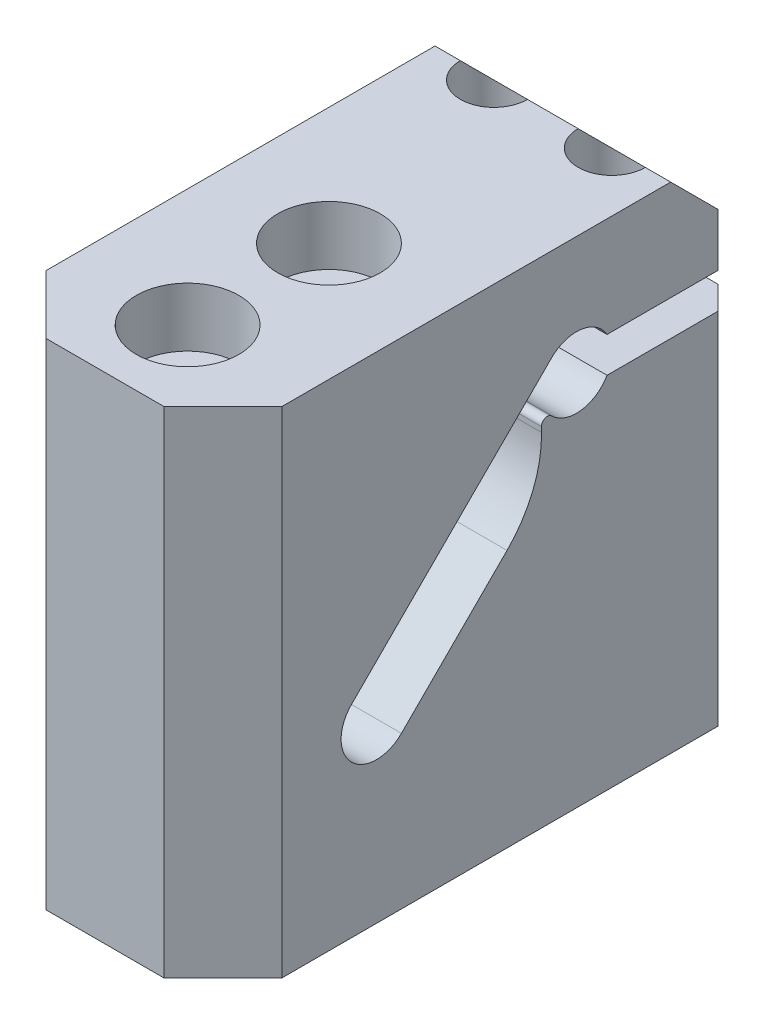
ISO-10303-21;
HEADER;
FILE_DESCRIPTION(('STEP AP214'),'2;1');
FILE_NAME('part.step','',(''),(''),'','','');
FILE_SCHEMA(('AUTOMOTIVE_DESIGN { 1 0 10303 214 1 1 1 1 }'));
ENDSEC;
DATA;
#1=APPLICATION_CONTEXT('core data for automotive mechanical design processes');
#2=APPLICATION_PROTOCOL_DEFINITION('international standard','automotive_design',2000,#1);
#3=PRODUCT_CONTEXT('',#1,'mechanical');
#4=PRODUCT('Part','Part','',(#3));
#5=PRODUCT_RELATED_PRODUCT_CATEGORY('part','',(#4));
#6=PRODUCT_DEFINITION_FORMATION('','',#4);
#7=PRODUCT_DEFINITION_CONTEXT('part definition',#1,'design');
#8=PRODUCT_DEFINITION('design','',#6,#7);
#9=PRODUCT_DEFINITION_SHAPE('','',#8);
#10=(LENGTH_UNIT() NAMED_UNIT(*) SI_UNIT(.MILLI.,.METRE.));
#11=(NAMED_UNIT(*) PLANE_ANGLE_UNIT() SI_UNIT($,.RADIAN.));
#12=(NAMED_UNIT(*) SI_UNIT($,.STERADIAN.) SOLID_ANGLE_UNIT());
#13=UNCERTAINTY_MEASURE_WITH_UNIT(LENGTH_MEASURE(1.E-05),#10,'distance_accuracy_value','');
#14=(GEOMETRIC_REPRESENTATION_CONTEXT(3) GLOBAL_UNCERTAINTY_ASSIGNED_CONTEXT((#13)) GLOBAL_UNIT_ASSIGNED_CONTEXT((#10,
#11,#12)) REPRESENTATION_CONTEXT('',''));
#15=CARTESIAN_POINT('',(0.,0.,0.));
#16=DIRECTION('',(0.,0.,1.));
#17=DIRECTION('',(1.,0.,0.));
#18=AXIS2_PLACEMENT_3D('',#15,#16,#17);
#19=CARTESIAN_POINT('',(20.,1.5,0.));
#20=DIRECTION('',(0.,-1.,0.));
#21=DIRECTION('',(0.,0.,-1.));
#22=AXIS2_PLACEMENT_3D('',#19,#20,#21);
#23=PLANE('',#22);
#24=DIRECTION('',(0.,0.,1.));
#25=VECTOR('',#24,1.);
#26=CARTESIAN_POINT('',(0.,1.5,0.));
#27=LINE('',#26,#25);
#28=CARTESIAN_POINT('',(0.,1.5,-12.));
#29=VERTEX_POINT('',#28);
#30=CARTESIAN_POINT('',(0.,1.5,-2.59807621135332));
#31=VERTEX_POINT('',#30);
#32=EDGE_CURVE('E350',#29,#31,#27,.T.);
#33=ORIENTED_EDGE('',*,*,#32,.F.);
#34=DIRECTION('',(-0.707106781186545,0.,0.70710678118655));
#35=VECTOR('',#34,1.);
#36=CARTESIAN_POINT('',(3.99999999999993,1.5,-16.));
#37=LINE('',#36,#35);
#38=CARTESIAN_POINT('',(1.99999999999999,1.5,-14.));
#39=VERTEX_POINT('',#38);
#40=EDGE_CURVE('E305',#29,#39,#37,.F.);
#41=ORIENTED_EDGE('',*,*,#40,.T.);
#42=DIRECTION('',(-1.,0.,0.));
#43=VECTOR('',#42,1.);
#44=CARTESIAN_POINT('',(20.,1.5,-14.));
#45=LINE('',#44,#43);
#46=CARTESIAN_POINT('',(18.,1.5,-14.));
#47=VERTEX_POINT('',#46);
#48=EDGE_CURVE('E229',#47,#39,#45,.T.);
#49=ORIENTED_EDGE('',*,*,#48,.F.);
#50=DIRECTION('',(0.707106781186549,0.,0.707106781186546));
#51=VECTOR('',#50,1.);
#52=CARTESIAN_POINT('',(26.,1.5,-6.00000000000003));
#53=LINE('',#52,#51);
#54=CARTESIAN_POINT('',(20.,1.5,-12.));
#55=VERTEX_POINT('',#54);
#56=EDGE_CURVE('E50',#47,#55,#53,.T.);
#57=ORIENTED_EDGE('',*,*,#56,.T.);
#58=DIRECTION('',(0.,0.,1.));
#59=VECTOR('',#58,1.);
#60=CARTESIAN_POINT('',(20.,1.5,0.));
#61=LINE('',#60,#59);
#62=CARTESIAN_POINT('',(20.,1.5,-2.59807621135332));
#63=VERTEX_POINT('',#62);
#64=EDGE_CURVE('E438',#55,#63,#61,.T.);
#65=ORIENTED_EDGE('',*,*,#64,.T.);
#66=DIRECTION('',(-1.,0.,0.));
#67=VECTOR('',#66,1.);
#68=CARTESIAN_POINT('',(20.,1.5,-2.59807621135332));
#69=LINE('',#68,#67);
#70=EDGE_CURVE('E232',#63,#31,#69,.T.);
#71=ORIENTED_EDGE('',*,*,#70,.T.);
#72=EDGE_LOOP('',(#33,#41,#49,#57,#65,#71));
#73=FACE_BOUND('',#72,.T.);
#74=CARTESIAN_POINT('',(5.,1.5,-8.));
#75=DIRECTION('',(0.,-1.,0.));
#76=DIRECTION('',(0.,0.,-1.));
#77=AXIS2_PLACEMENT_3D('',#74,#75,#76);
#78=CIRCLE('',#77,1.5);
#79=CARTESIAN_POINT('',(5.,1.5,-9.50000000000001));
#80=VERTEX_POINT('',#79);
#81=EDGE_CURVE('E830',#80,#80,#78,.T.);
#82=ORIENTED_EDGE('',*,*,#81,.F.);
#83=EDGE_LOOP('',(#82));
#84=FACE_BOUND('',#83,.T.);
#85=CARTESIAN_POINT('',(15.,1.5,-8.));
#86=DIRECTION('',(0.,-1.,0.));
#87=DIRECTION('',(0.,0.,-1.));
#88=AXIS2_PLACEMENT_3D('',#85,#86,#87);
#89=CIRCLE('',#88,1.5);
#90=CARTESIAN_POINT('',(15.,1.5,-9.50000000000001));
#91=VERTEX_POINT('',#90);
#92=EDGE_CURVE('E815',#91,#91,#89,.F.);
#93=ORIENTED_EDGE('',*,*,#92,.T.);
#94=EDGE_LOOP('',(#93));
#95=FACE_BOUND('',#94,.T.);
#96=ADVANCED_FACE('F35',(#73,#84,#95),#23,.T.);
#97=CARTESIAN_POINT('',(20.,-32.,0.));
#98=DIRECTION('',(0.,-1.,0.));
#99=DIRECTION('',(0.,0.,-1.));
#100=AXIS2_PLACEMENT_3D('',#97,#98,#99);
#101=PLANE('',#100);
#102=DIRECTION('',(0.,0.,1.));
#103=VECTOR('',#102,1.);
#104=CARTESIAN_POINT('',(0.,-32.,0.));
#105=LINE('',#104,#103);
#106=CARTESIAN_POINT('',(0.,-32.,-12.));
#107=VERTEX_POINT('',#106);
#108=CARTESIAN_POINT('',(0.,-32.,25.));
#109=VERTEX_POINT('',#108);
#110=EDGE_CURVE('E358',#107,#109,#105,.T.);
#111=ORIENTED_EDGE('',*,*,#110,.F.);
#112=DIRECTION('',(-0.707106781186545,0.,0.70710678118655));
#113=VECTOR('',#112,1.);
#114=CARTESIAN_POINT('',(3.99999999999994,-32.,-16.));
#115=LINE('',#114,#113);
#116=CARTESIAN_POINT('',(1.99999999999999,-32.,-14.));
#117=VERTEX_POINT('',#116);
#118=EDGE_CURVE('E294',#107,#117,#115,.F.);
#119=ORIENTED_EDGE('',*,*,#118,.T.);
#120=DIRECTION('',(-1.,0.,0.));
#121=VECTOR('',#120,1.);
#122=CARTESIAN_POINT('',(20.,-32.,-14.));
#123=LINE('',#122,#121);
#124=CARTESIAN_POINT('',(18.,-32.,-14.));
#125=VERTEX_POINT('',#124);
#126=EDGE_CURVE('E372',#125,#117,#123,.T.);
#127=ORIENTED_EDGE('',*,*,#126,.F.);
#128=DIRECTION('',(0.707106781186549,0.,0.707106781186546));
#129=VECTOR('',#128,1.);
#130=CARTESIAN_POINT('',(26.,-32.,-6.00000000000003));
#131=LINE('',#130,#129);
#132=CARTESIAN_POINT('',(20.,-32.,-12.));
#133=VERTEX_POINT('',#132);
#134=EDGE_CURVE('E292',#125,#133,#131,.T.);
#135=ORIENTED_EDGE('',*,*,#134,.T.);
#136=DIRECTION('',(0.,0.,1.));
#137=VECTOR('',#136,1.);
#138=CARTESIAN_POINT('',(20.,-32.,0.));
#139=LINE('',#138,#137);
#140=CARTESIAN_POINT('',(20.,-32.,25.));
#141=VERTEX_POINT('',#140);
#142=EDGE_CURVE('E315',#133,#141,#139,.T.);
#143=ORIENTED_EDGE('',*,*,#142,.T.);
#144=DIRECTION('',(0.707106781186546,0.,-0.707106781186549));
#145=VECTOR('',#144,1.);
#146=CARTESIAN_POINT('',(32.5,-32.,12.4999999999999));
#147=LINE('',#146,#145);
#148=CARTESIAN_POINT('',(15.,-32.,30.));
#149=VERTEX_POINT('',#148);
#150=EDGE_CURVE('E274',#141,#149,#147,.F.);
#151=ORIENTED_EDGE('',*,*,#150,.T.);
#152=DIRECTION('',(-1.,0.,0.));
#153=VECTOR('',#152,1.);
#154=CARTESIAN_POINT('',(20.,-32.,30.));
#155=LINE('',#154,#153);
#156=CARTESIAN_POINT('',(5.00000000000001,-32.,30.));
#157=VERTEX_POINT('',#156);
#158=EDGE_CURVE('E374',#149,#157,#155,.T.);
#159=ORIENTED_EDGE('',*,*,#158,.T.);
#160=DIRECTION('',(-0.707106781186549,0.,-0.707106781186546));
#161=VECTOR('',#160,1.);
#162=CARTESIAN_POINT('',(-2.49999999999997,-32.,22.5000000000001));
#163=LINE('',#162,#161);
#164=EDGE_CURVE('E271',#157,#109,#163,.T.);
#165=ORIENTED_EDGE('',*,*,#164,.T.);
#166=EDGE_LOOP('',(#111,#119,#127,#135,#143,#151,#159,#165));
#167=FACE_BOUND('',#166,.T.);
#168=CARTESIAN_POINT('',(10.,-32.,23.));
#169=DIRECTION('',(0.,1.,0.));
#170=DIRECTION('',(0.,0.,1.));
#171=AXIS2_PLACEMENT_3D('',#168,#169,#170);
#172=CIRCLE('',#171,2.5);
#173=CARTESIAN_POINT('',(10.,-32.,25.5));
#174=VERTEX_POINT('',#173);
#175=EDGE_CURVE('E858',#174,#174,#172,.T.);
#176=ORIENTED_EDGE('',*,*,#175,.T.);
#177=EDGE_LOOP('',(#176));
#178=FACE_BOUND('',#177,.T.);
#179=CARTESIAN_POINT('',(10.,-32.,11.));
#180=DIRECTION('',(0.,1.,0.));
#181=DIRECTION('',(0.,0.,1.));
#182=AXIS2_PLACEMENT_3D('',#179,#180,#181);
#183=CIRCLE('',#182,2.5);
#184=CARTESIAN_POINT('',(10.,-32.,13.5));
#185=VERTEX_POINT('',#184);
#186=EDGE_CURVE('E859',#185,#185,#183,.T.);
#187=ORIENTED_EDGE('',*,*,#186,.T.);
#188=EDGE_LOOP('',(#187));
#189=FACE_BOUND('',#188,.T.);
#190=CARTESIAN_POINT('',(5.,-32.,-8.00000000000001));
#191=DIRECTION('',(0.,1.,0.));
#192=DIRECTION('',(0.,0.,1.));
#193=AXIS2_PLACEMENT_3D('',#190,#191,#192);
#194=CIRCLE('',#193,1.5);
#195=CARTESIAN_POINT('',(5.,-32.,-6.50000000000001));
#196=VERTEX_POINT('',#195);
#197=EDGE_CURVE('E861',#196,#196,#194,.T.);
#198=ORIENTED_EDGE('',*,*,#197,.T.);
#199=EDGE_LOOP('',(#198));
#200=FACE_BOUND('',#199,.T.);
#201=CARTESIAN_POINT('',(15.,-32.,-8.00000000000001));
#202=DIRECTION('',(0.,1.,0.));
#203=DIRECTION('',(0.,0.,1.));
#204=AXIS2_PLACEMENT_3D('',#201,#202,#203);
#205=CIRCLE('',#204,1.5);
#206=CARTESIAN_POINT('',(15.,-32.,-6.50000000000001));
#207=VERTEX_POINT('',#206);
#208=EDGE_CURVE('E811',#207,#207,#205,.F.);
#209=ORIENTED_EDGE('',*,*,#208,.F.);
#210=EDGE_LOOP('',(#209));
#211=FACE_BOUND('',#210,.T.);
#212=ADVANCED_FACE('F388',(#167,#178,#189,#200,#211),#101,.T.);
#213=CARTESIAN_POINT('',(20.,-1.5,0.));
#214=DIRECTION('',(0.,-1.,0.));
#215=DIRECTION('',(0.,0.,-1.));
#216=AXIS2_PLACEMENT_3D('',#213,#214,#215);
#217=PLANE('',#216);
#218=CARTESIAN_POINT('',(5.,-1.5,-8.00000000000001));
#219=DIRECTION('',(0.,-1.,0.));
#220=DIRECTION('',(0.,0.,-1.));
#221=AXIS2_PLACEMENT_3D('',#218,#219,#220);
#222=CIRCLE('',#221,1.5);
#223=CARTESIAN_POINT('',(5.,-1.5,-9.50000000000001));
#224=VERTEX_POINT('',#223);
#225=EDGE_CURVE('E827',#224,#224,#222,.T.);
#226=ORIENTED_EDGE('',*,*,#225,.T.);
#227=EDGE_LOOP('',(#226));
#228=FACE_BOUND('',#227,.T.);
#229=DIRECTION('',(-1.,0.,0.));
#230=VECTOR('',#229,1.);
#231=CARTESIAN_POINT('',(20.,-1.5,-14.));
#232=LINE('',#231,#230);
#233=CARTESIAN_POINT('',(18.,-1.5,-14.));
#234=VERTEX_POINT('',#233);
#235=CARTESIAN_POINT('',(1.99999999999999,-1.5,-14.));
#236=VERTEX_POINT('',#235);
#237=EDGE_CURVE('E370',#234,#236,#232,.T.);
#238=ORIENTED_EDGE('',*,*,#237,.T.);
#239=DIRECTION('',(0.707106781186545,0.,-0.70710678118655));
#240=VECTOR('',#239,1.);
#241=CARTESIAN_POINT('',(1.99999999999999,-1.5,-14.));
#242=LINE('',#241,#240);
#243=CARTESIAN_POINT('',(0.,-1.5,-12.));
#244=VERTEX_POINT('',#243);
#245=EDGE_CURVE('E286',#236,#244,#242,.F.);
#246=ORIENTED_EDGE('',*,*,#245,.T.);
#247=DIRECTION('',(0.,0.,1.));
#248=VECTOR('',#247,1.);
#249=CARTESIAN_POINT('',(0.,-1.5,0.));
#250=LINE('',#249,#248);
#251=CARTESIAN_POINT('',(0.,-1.5,-2.59807621135332));
#252=VERTEX_POINT('',#251);
#253=EDGE_CURVE('E360',#244,#252,#250,.T.);
#254=ORIENTED_EDGE('',*,*,#253,.T.);
#255=DIRECTION('',(-1.,0.,0.));
#256=VECTOR('',#255,1.);
#257=CARTESIAN_POINT('',(20.,-1.5,-2.59807621135332));
#258=LINE('',#257,#256);
#259=CARTESIAN_POINT('',(20.,-1.5,-2.59807621135332));
#260=VERTEX_POINT('',#259);
#261=EDGE_CURVE('E325',#260,#252,#258,.T.);
#262=ORIENTED_EDGE('',*,*,#261,.F.);
#263=DIRECTION('',(0.,0.,1.));
#264=VECTOR('',#263,1.);
#265=CARTESIAN_POINT('',(20.,-1.5,0.));
#266=LINE('',#265,#264);
#267=CARTESIAN_POINT('',(20.,-1.5,-12.));
#268=VERTEX_POINT('',#267);
#269=EDGE_CURVE('E313',#268,#260,#266,.T.);
#270=ORIENTED_EDGE('',*,*,#269,.F.);
#271=DIRECTION('',(-0.707106781186549,0.,-0.707106781186546));
#272=VECTOR('',#271,1.);
#273=CARTESIAN_POINT('',(20.,-1.5,-12.));
#274=LINE('',#273,#272);
#275=EDGE_CURVE('E284',#268,#234,#274,.T.);
#276=ORIENTED_EDGE('',*,*,#275,.T.);
#277=EDGE_LOOP('',(#238,#246,#254,#262,#270,#276));
#278=FACE_BOUND('',#277,.T.);
#279=CARTESIAN_POINT('',(15.,-1.5,-8.00000000000001));
#280=DIRECTION('',(0.,-1.,0.));
#281=DIRECTION('',(0.,0.,-1.));
#282=AXIS2_PLACEMENT_3D('',#279,#280,#281);
#283=CIRCLE('',#282,1.5);
#284=CARTESIAN_POINT('',(15.,-1.5,-9.50000000000001));
#285=VERTEX_POINT('',#284);
#286=EDGE_CURVE('E814',#285,#285,#283,.F.);
#287=ORIENTED_EDGE('',*,*,#286,.F.);
#288=EDGE_LOOP('',(#287));
#289=FACE_BOUND('',#288,.T.);
#290=ADVANCED_FACE('F321',(#228,#278,#289),#217,.F.);
#291=CARTESIAN_POINT('',(20.,9.,-9.));
#292=DIRECTION('',(0.,-0.707106781186547,0.707106781186548));
#293=DIRECTION('',(0.,-0.707106781186548,-0.707106781186547));
#294=AXIS2_PLACEMENT_3D('',#291,#292,#293);
#295=PLANE('',#294);
#296=DIRECTION('',(-1.,0.,0.));
#297=VECTOR('',#296,1.);
#298=CARTESIAN_POINT('',(20.,4.,-14.));
#299=LINE('',#298,#297);
#300=CARTESIAN_POINT('',(18.,4.,-14.));
#301=VERTEX_POINT('',#300);
#302=CARTESIAN_POINT('',(1.99999999999999,4.,-14.));
#303=VERTEX_POINT('',#302);
#304=EDGE_CURVE('E223',#301,#303,#299,.T.);
#305=ORIENTED_EDGE('',*,*,#304,.T.);
#306=DIRECTION('',(0.577350269189623,-0.577350269189627,-0.577350269189627));
#307=VECTOR('',#306,1.);
#308=CARTESIAN_POINT('',(3.33333333333332,2.66666666666666,-15.3333333333333));
#309=LINE('',#308,#307);
#310=CARTESIAN_POINT('',(0.,6.00000000000001,-12.));
#311=VERTEX_POINT('',#310);
#312=EDGE_CURVE('E302',#303,#311,#309,.F.);
#313=ORIENTED_EDGE('',*,*,#312,.T.);
#314=DIRECTION('',(0.,0.707106781186548,0.707106781186547));
#315=VECTOR('',#314,1.);
#316=CARTESIAN_POINT('',(0.,9.,-9.));
#317=LINE('',#316,#315);
#318=CARTESIAN_POINT('',(0.,10.,-8.));
#319=VERTEX_POINT('',#318);
#320=EDGE_CURVE('E353',#311,#319,#317,.T.);
#321=ORIENTED_EDGE('',*,*,#320,.T.);
#322=DIRECTION('',(-1.,0.,0.));
#323=VECTOR('',#322,1.);
#324=CARTESIAN_POINT('',(20.,10.,-8.));
#325=LINE('',#324,#323);
#326=CARTESIAN_POINT('',(2.15,10.,-8.));
#327=VERTEX_POINT('',#326);
#328=EDGE_CURVE('E213',#327,#319,#325,.T.);
#329=ORIENTED_EDGE('',*,*,#328,.F.);
#330=CARTESIAN_POINT('',(5.,10.,-8.));
#331=DIRECTION('',(0.,-0.707106781186547,0.707106781186548));
#332=DIRECTION('',(0.,0.707106781186548,0.707106781186547));
#333=AXIS2_PLACEMENT_3D('',#330,#331,#332);
#334=ELLIPSE('',#333,4.03050865276332,2.85);
#335=CARTESIAN_POINT('',(7.85,10.,-8.));
#336=VERTEX_POINT('',#335);
#337=EDGE_CURVE('E199',#327,#336,#334,.T.);
#338=ORIENTED_EDGE('',*,*,#337,.T.);
#339=CARTESIAN_POINT('',(12.15,10.,-8.));
#340=VERTEX_POINT('',#339);
#341=EDGE_CURVE('E212',#340,#336,#325,.T.);
#342=ORIENTED_EDGE('',*,*,#341,.F.);
#343=CARTESIAN_POINT('',(15.,10.,-8.));
#344=DIRECTION('',(0.,-0.707106781186547,0.707106781186548));
#345=DIRECTION('',(0.,0.707106781186548,0.707106781186547));
#346=AXIS2_PLACEMENT_3D('',#343,#344,#345);
#347=ELLIPSE('',#346,4.03050865276332,2.85);
#348=CARTESIAN_POINT('',(17.85,10.,-8.));
#349=VERTEX_POINT('',#348);
#350=EDGE_CURVE('E214',#340,#349,#347,.T.);
#351=ORIENTED_EDGE('',*,*,#350,.T.);
#352=CARTESIAN_POINT('',(20.,10.,-8.));
#353=VERTEX_POINT('',#352);
#354=EDGE_CURVE('E221',#353,#349,#325,.T.);
#355=ORIENTED_EDGE('',*,*,#354,.F.);
#356=DIRECTION('',(0.,0.707106781186548,0.707106781186547));
#357=VECTOR('',#356,1.);
#358=CARTESIAN_POINT('',(20.,9.,-9.));
#359=LINE('',#358,#357);
#360=CARTESIAN_POINT('',(20.,5.99999999999999,-12.));
#361=VERTEX_POINT('',#360);
#362=EDGE_CURVE('E440',#361,#353,#359,.T.);
#363=ORIENTED_EDGE('',*,*,#362,.F.);
#364=DIRECTION('',(-0.577350269189627,-0.577350269189625,-0.577350269189625));
#365=VECTOR('',#364,1.);
#366=CARTESIAN_POINT('',(18.,3.99999999999999,-14.));
#367=LINE('',#366,#365);
#368=EDGE_CURVE('E58',#361,#301,#367,.T.);
#369=ORIENTED_EDGE('',*,*,#368,.T.);
#370=EDGE_LOOP('',(#305,#313,#321,#329,#338,#342,#351,#355,#363,#369));
#371=FACE_BOUND('',#370,.T.);
#372=ADVANCED_FACE('F210',(#371),#295,.F.);
#373=CARTESIAN_POINT('',(20.,10.,0.));
#374=DIRECTION('',(0.,-1.,0.));
#375=DIRECTION('',(0.,0.,-1.));
#376=AXIS2_PLACEMENT_3D('',#373,#374,#375);
#377=PLANE('',#376);
#378=CARTESIAN_POINT('',(10.,10.,23.));
#379=DIRECTION('',(0.,1.,0.));
#380=DIRECTION('',(0.,0.,1.));
#381=AXIS2_PLACEMENT_3D('',#378,#379,#380);
#382=CIRCLE('',#381,4.35);
#383=CARTESIAN_POINT('',(10.,9.99999999999999,27.35));
#384=VERTEX_POINT('',#383);
#385=EDGE_CURVE('E434',#384,#384,#382,.T.);
#386=ORIENTED_EDGE('',*,*,#385,.F.);
#387=EDGE_LOOP('',(#386));
#388=FACE_BOUND('',#387,.T.);
#389=CARTESIAN_POINT('',(10.,10.,11.));
#390=DIRECTION('',(0.,1.,0.));
#391=DIRECTION('',(0.,0.,1.));
#392=AXIS2_PLACEMENT_3D('',#389,#390,#391);
#393=CIRCLE('',#392,4.35);
#394=CARTESIAN_POINT('',(10.,10.,15.35));
#395=VERTEX_POINT('',#394);
#396=EDGE_CURVE('E504',#395,#395,#393,.T.);
#397=ORIENTED_EDGE('',*,*,#396,.F.);
#398=EDGE_LOOP('',(#397));
#399=FACE_BOUND('',#398,.T.);
#400=DIRECTION('',(-1.,0.,0.));
#401=VECTOR('',#400,1.);
#402=CARTESIAN_POINT('',(20.,9.99999999999999,30.));
#403=LINE('',#402,#401);
#404=CARTESIAN_POINT('',(15.,9.99999999999999,30.));
#405=VERTEX_POINT('',#404);
#406=CARTESIAN_POINT('',(5.00000000000001,9.99999999999999,30.));
#407=VERTEX_POINT('',#406);
#408=EDGE_CURVE('E224',#405,#407,#403,.T.);
#409=ORIENTED_EDGE('',*,*,#408,.F.);
#410=DIRECTION('',(-0.707106781186546,0.,0.707106781186549));
#411=VECTOR('',#410,1.);
#412=CARTESIAN_POINT('',(15.,9.99999999999999,30.));
#413=LINE('',#412,#411);
#414=CARTESIAN_POINT('',(20.,10.,25.));
#415=VERTEX_POINT('',#414);
#416=EDGE_CURVE('E266',#405,#415,#413,.F.);
#417=ORIENTED_EDGE('',*,*,#416,.T.);
#418=DIRECTION('',(0.,0.,1.));
#419=VECTOR('',#418,1.);
#420=CARTESIAN_POINT('',(20.,10.,0.));
#421=LINE('',#420,#419);
#422=EDGE_CURVE('E331',#353,#415,#421,.T.);
#423=ORIENTED_EDGE('',*,*,#422,.F.);
#424=ORIENTED_EDGE('',*,*,#354,.T.);
#425=CARTESIAN_POINT('',(15.,10.,-8.));
#426=DIRECTION('',(0.,-1.,0.));
#427=DIRECTION('',(0.,0.,-1.));
#428=AXIS2_PLACEMENT_3D('',#425,#426,#427);
#429=CIRCLE('',#428,2.85);
#430=EDGE_CURVE('E204',#349,#340,#429,.T.);
#431=ORIENTED_EDGE('',*,*,#430,.T.);
#432=ORIENTED_EDGE('',*,*,#341,.T.);
#433=CARTESIAN_POINT('',(5.,10.,-8.));
#434=DIRECTION('',(0.,-1.,0.));
#435=DIRECTION('',(0.,0.,-1.));
#436=AXIS2_PLACEMENT_3D('',#433,#434,#435);
#437=CIRCLE('',#436,2.85);
#438=EDGE_CURVE('E196',#336,#327,#437,.T.);
#439=ORIENTED_EDGE('',*,*,#438,.T.);
#440=ORIENTED_EDGE('',*,*,#328,.T.);
#441=DIRECTION('',(0.,0.,1.));
#442=VECTOR('',#441,1.);
#443=CARTESIAN_POINT('',(0.,10.,0.));
#444=LINE('',#443,#442);
#445=CARTESIAN_POINT('',(0.,10.,25.));
#446=VERTEX_POINT('',#445);
#447=EDGE_CURVE('E355',#319,#446,#444,.T.);
#448=ORIENTED_EDGE('',*,*,#447,.T.);
#449=DIRECTION('',(0.707106781186549,0.,0.707106781186546));
#450=VECTOR('',#449,1.);
#451=CARTESIAN_POINT('',(0.,10.,25.));
#452=LINE('',#451,#450);
#453=EDGE_CURVE('E264',#446,#407,#452,.T.);
#454=ORIENTED_EDGE('',*,*,#453,.T.);
#455=EDGE_LOOP('',(#409,#417,#423,#424,#431,#432,#439,#440,#448,#454));
#456=FACE_BOUND('',#455,.T.);
#457=ADVANCED_FACE('F219',(#388,#399,#456),#377,.F.);
#458=CARTESIAN_POINT('',(20.,-16.9705627484771,16.9705627484772));
#459=DIRECTION('',(-1.,0.,0.));
#460=DIRECTION('',(0.,0.,1.));
#461=AXIS2_PLACEMENT_3D('',#458,#459,#460);
#462=CYLINDRICAL_SURFACE('',#461,3.);
#463=CARTESIAN_POINT('',(0.,-16.9705627484771,16.9705627484772));
#464=DIRECTION('',(1.,0.,0.));
#465=DIRECTION('',(0.,0.,-1.));
#466=AXIS2_PLACEMENT_3D('',#463,#464,#465);
#467=CIRCLE('',#466,3.);
#468=CARTESIAN_POINT('',(0.,-14.8492424049174,19.0918830920369));
#469=VERTEX_POINT('',#468);
#470=CARTESIAN_POINT('',(0.,-19.0918830920367,14.8492424049176));
#471=VERTEX_POINT('',#470);
#472=EDGE_CURVE('E340',#469,#471,#467,.T.);
#473=ORIENTED_EDGE('',*,*,#472,.F.);
#474=DIRECTION('',(-1.,0.,0.));
#475=VECTOR('',#474,1.);
#476=CARTESIAN_POINT('',(20.,-14.8492424049174,19.0918830920369));
#477=LINE('',#476,#475);
#478=CARTESIAN_POINT('',(20.,-14.8492424049174,19.0918830920369));
#479=VERTEX_POINT('',#478);
#480=EDGE_CURVE('E237',#479,#469,#477,.T.);
#481=ORIENTED_EDGE('',*,*,#480,.F.);
#482=CARTESIAN_POINT('',(20.,-16.9705627484771,16.9705627484772));
#483=DIRECTION('',(1.,0.,0.));
#484=DIRECTION('',(0.,0.,-1.));
#485=AXIS2_PLACEMENT_3D('',#482,#483,#484);
#486=CIRCLE('',#485,3.);
#487=CARTESIAN_POINT('',(20.,-19.0918830920367,14.8492424049176));
#488=VERTEX_POINT('',#487);
#489=EDGE_CURVE('E367',#479,#488,#486,.T.);
#490=ORIENTED_EDGE('',*,*,#489,.T.);
#491=DIRECTION('',(-1.,0.,0.));
#492=VECTOR('',#491,1.);
#493=CARTESIAN_POINT('',(20.,-19.0918830920367,14.8492424049176));
#494=LINE('',#493,#492);
#495=EDGE_CURVE('E339',#488,#471,#494,.T.);
#496=ORIENTED_EDGE('',*,*,#495,.T.);
#497=EDGE_LOOP('',(#473,#481,#490,#496));
#498=FACE_BOUND('',#497,.T.);
#499=ADVANCED_FACE('F428',(#498),#462,.F.);
#500=CARTESIAN_POINT('',(20.,2.12132034355965,2.12132034355963));
#501=DIRECTION('',(0.,0.707106781186551,0.707106781186544));
#502=DIRECTION('',(0.,-0.707106781186544,0.707106781186551));
#503=AXIS2_PLACEMENT_3D('',#500,#501,#502);
#504=PLANE('',#503);
#505=CARTESIAN_POINT('',(10.,-6.75735931288063,11.));
#506=DIRECTION('',(0.,0.707106781186551,0.707106781186544));
#507=DIRECTION('',(0.,0.707106781186544,-0.707106781186551));
#508=AXIS2_PLACEMENT_3D('',#505,#506,#507);
#509=ELLIPSE('',#508,3.53553390593272,2.5);
#510=CARTESIAN_POINT('',(10.,-4.25735931288065,8.49999999999999));
#511=VERTEX_POINT('',#510);
#512=EDGE_CURVE('E839',#511,#511,#509,.T.);
#513=ORIENTED_EDGE('',*,*,#512,.T.);
#514=EDGE_LOOP('',(#513));
#515=FACE_BOUND('',#514,.T.);
#516=DIRECTION('',(0.,0.707106781186544,-0.707106781186551));
#517=VECTOR('',#516,1.);
#518=CARTESIAN_POINT('',(0.,2.12132034355965,2.12132034355963));
#519=LINE('',#518,#517);
#520=CARTESIAN_POINT('',(0.,2.12132034355965,2.12132034355963));
#521=VERTEX_POINT('',#520);
#522=EDGE_CURVE('E343',#469,#521,#519,.T.);
#523=ORIENTED_EDGE('',*,*,#522,.T.);
#524=DIRECTION('',(-1.,0.,0.));
#525=VECTOR('',#524,1.);
#526=CARTESIAN_POINT('',(20.,2.12132034355965,2.12132034355963));
#527=LINE('',#526,#525);
#528=CARTESIAN_POINT('',(20.,2.12132034355965,2.12132034355963));
#529=VERTEX_POINT('',#528);
#530=EDGE_CURVE('E235',#529,#521,#527,.T.);
#531=ORIENTED_EDGE('',*,*,#530,.F.);
#532=DIRECTION('',(0.,0.707106781186544,-0.707106781186551));
#533=VECTOR('',#532,1.);
#534=CARTESIAN_POINT('',(20.,2.12132034355965,2.12132034355963));
#535=LINE('',#534,#533);
#536=EDGE_CURVE('E430',#479,#529,#535,.T.);
#537=ORIENTED_EDGE('',*,*,#536,.F.);
#538=ORIENTED_EDGE('',*,*,#480,.T.);
#539=EDGE_LOOP('',(#523,#531,#537,#538));
#540=FACE_BOUND('',#539,.T.);
#541=ADVANCED_FACE('F466',(#515,#540),#504,.F.);
#542=CARTESIAN_POINT('',(20.,0.,0.));
#543=DIRECTION('',(-1.,0.,0.));
#544=DIRECTION('',(0.,0.,1.));
#545=AXIS2_PLACEMENT_3D('',#542,#543,#544);
#546=CYLINDRICAL_SURFACE('',#545,3.);
#547=CARTESIAN_POINT('',(0.,0.,0.));
#548=DIRECTION('',(1.,0.,0.));
#549=DIRECTION('',(0.,0.,-1.));
#550=AXIS2_PLACEMENT_3D('',#547,#548,#549);
#551=CIRCLE('',#550,3.);
#552=EDGE_CURVE('E347',#31,#521,#551,.T.);
#553=ORIENTED_EDGE('',*,*,#552,.F.);
#554=ORIENTED_EDGE('',*,*,#70,.F.);
#555=CARTESIAN_POINT('',(20.,0.,0.));
#556=DIRECTION('',(1.,0.,0.));
#557=DIRECTION('',(0.,0.,-1.));
#558=AXIS2_PLACEMENT_3D('',#555,#556,#557);
#559=CIRCLE('',#558,3.);
#560=EDGE_CURVE('E330',#63,#529,#559,.T.);
#561=ORIENTED_EDGE('',*,*,#560,.T.);
#562=ORIENTED_EDGE('',*,*,#530,.T.);
#563=EDGE_LOOP('',(#553,#554,#561,#562));
#564=FACE_BOUND('',#563,.T.);
#565=ADVANCED_FACE('F469',(#564),#546,.F.);
#566=CARTESIAN_POINT('',(20.,0.,-14.));
#567=DIRECTION('',(0.,0.,1.));
#568=DIRECTION('',(0.,-1.,0.));
#569=AXIS2_PLACEMENT_3D('',#566,#567,#568);
#570=PLANE('',#569);
#571=ORIENTED_EDGE('',*,*,#48,.T.);
#572=DIRECTION('',(0.,1.,0.));
#573=VECTOR('',#572,1.);
#574=CARTESIAN_POINT('',(1.99999999999999,0.,-14.));
#575=LINE('',#574,#573);
#576=EDGE_CURVE('E298',#39,#303,#575,.T.);
#577=ORIENTED_EDGE('',*,*,#576,.T.);
#578=ORIENTED_EDGE('',*,*,#304,.F.);
#579=DIRECTION('',(0.,-1.,0.));
#580=VECTOR('',#579,1.);
#581=CARTESIAN_POINT('',(18.,1.5,-14.));
#582=LINE('',#581,#580);
#583=EDGE_CURVE('E296',#301,#47,#582,.T.);
#584=ORIENTED_EDGE('',*,*,#583,.T.);
#585=EDGE_LOOP('',(#571,#577,#578,#584));
#586=FACE_BOUND('',#585,.T.);
#587=ADVANCED_FACE('F493',(#586),#570,.F.);
#588=CARTESIAN_POINT('',(20.,0.,30.));
#589=DIRECTION('',(0.,0.,1.));
#590=DIRECTION('',(1.,0.,0.));
#591=AXIS2_PLACEMENT_3D('',#588,#589,#590);
#592=PLANE('',#591);
#593=ORIENTED_EDGE('',*,*,#158,.F.);
#594=DIRECTION('',(0.,1.,0.));
#595=VECTOR('',#594,1.);
#596=CARTESIAN_POINT('',(15.,0.,30.));
#597=LINE('',#596,#595);
#598=EDGE_CURVE('E261',#149,#405,#597,.T.);
#599=ORIENTED_EDGE('',*,*,#598,.T.);
#600=ORIENTED_EDGE('',*,*,#408,.T.);
#601=DIRECTION('',(0.,-1.,0.));
#602=VECTOR('',#601,1.);
#603=CARTESIAN_POINT('',(5.00000000000001,-32.,30.));
#604=LINE('',#603,#602);
#605=EDGE_CURVE('E259',#407,#157,#604,.T.);
#606=ORIENTED_EDGE('',*,*,#605,.T.);
#607=EDGE_LOOP('',(#593,#599,#600,#606));
#608=FACE_BOUND('',#607,.T.);
#609=ADVANCED_FACE('F382',(#608),#592,.T.);
#610=ORIENTED_EDGE('',*,*,#126,.T.);
#611=DIRECTION('',(0.,1.,0.));
#612=VECTOR('',#611,1.);
#613=CARTESIAN_POINT('',(1.99999999999999,0.,-14.));
#614=LINE('',#613,#612);
#615=EDGE_CURVE('E281',#117,#236,#614,.T.);
#616=ORIENTED_EDGE('',*,*,#615,.T.);
#617=ORIENTED_EDGE('',*,*,#237,.F.);
#618=DIRECTION('',(0.,-1.,0.));
#619=VECTOR('',#618,1.);
#620=CARTESIAN_POINT('',(18.,-32.,-14.));
#621=LINE('',#620,#619);
#622=EDGE_CURVE('E279',#234,#125,#621,.T.);
#623=ORIENTED_EDGE('',*,*,#622,.T.);
#624=EDGE_LOOP('',(#610,#616,#617,#623));
#625=FACE_BOUND('',#624,.T.);
#626=ADVANCED_FACE('F398',(#625),#570,.F.);
#627=CARTESIAN_POINT('',(0.,-2.12854055269162,2.11407547536678));
#628=VERTEX_POINT('',#627);
#629=EDGE_CURVE('E351',#628,#252,#551,.T.);
#630=ORIENTED_EDGE('',*,*,#629,.F.);
#631=DIRECTION('',(-1.,0.,0.));
#632=VECTOR('',#631,1.);
#633=CARTESIAN_POINT('',(20.,-2.12854055269162,2.11407547536678));
#634=LINE('',#633,#632);
#635=CARTESIAN_POINT('',(20.,-2.12854055269162,2.11407547536678));
#636=VERTEX_POINT('',#635);
#637=EDGE_CURVE('E255',#628,#636,#634,.F.);
#638=ORIENTED_EDGE('',*,*,#637,.T.);
#639=EDGE_CURVE('E326',#636,#260,#559,.T.);
#640=ORIENTED_EDGE('',*,*,#639,.T.);
#641=ORIENTED_EDGE('',*,*,#261,.T.);
#642=EDGE_LOOP('',(#630,#638,#640,#641));
#643=FACE_BOUND('',#642,.T.);
#644=ADVANCED_FACE('F407',(#643),#546,.F.);
#645=CARTESIAN_POINT('',(20.,-0.0405029010779166,2.999453071958));
#646=DIRECTION('',(0.,0.0135021978705141,-0.999908841171367));
#647=DIRECTION('',(0.,0.999908841171367,0.0135021978705141));
#648=AXIS2_PLACEMENT_3D('',#645,#646,#647);
#649=PLANE('',#648);
#650=DIRECTION('',(0.,-0.999908841171367,-0.0135021978705141));
#651=VECTOR('',#650,1.);
#652=CARTESIAN_POINT('',(20.,-0.0405029010779166,2.999453071958));
#653=LINE('',#652,#651);
#654=CARTESIAN_POINT('',(20.,-2.49004841040881,2.96637580851359));
#655=VERTEX_POINT('',#654);
#656=CARTESIAN_POINT('',(20.,-2.92507298157551,2.96050148517873));
#657=VERTEX_POINT('',#656);
#658=EDGE_CURVE('E328',#655,#657,#653,.T.);
#659=ORIENTED_EDGE('',*,*,#658,.F.);
#660=DIRECTION('',(1.,0.,0.));
#661=VECTOR('',#660,1.);
#662=CARTESIAN_POINT('',(0.,-2.49004841040881,2.96637580851359));
#663=LINE('',#662,#661);
#664=CARTESIAN_POINT('',(0.,-2.49004841040881,2.96637580851359));
#665=VERTEX_POINT('',#664);
#666=EDGE_CURVE('E250',#655,#665,#663,.F.);
#667=ORIENTED_EDGE('',*,*,#666,.T.);
#668=DIRECTION('',(0.,-0.999908841171367,-0.0135021978705141));
#669=VECTOR('',#668,1.);
#670=CARTESIAN_POINT('',(0.,-0.0405029010779166,2.999453071958));
#671=LINE('',#670,#669);
#672=CARTESIAN_POINT('',(0.,-2.92507298157551,2.96050148517873));
#673=VERTEX_POINT('',#672);
#674=EDGE_CURVE('E362',#665,#673,#671,.T.);
#675=ORIENTED_EDGE('',*,*,#674,.T.);
#676=DIRECTION('',(-1.,0.,0.));
#677=VECTOR('',#676,1.);
#678=CARTESIAN_POINT('',(20.,-2.92507298157551,2.96050148517873));
#679=LINE('',#678,#677);
#680=EDGE_CURVE('E242',#673,#657,#679,.F.);
#681=ORIENTED_EDGE('',*,*,#680,.T.);
#682=EDGE_LOOP('',(#659,#667,#675,#681));
#683=FACE_BOUND('',#682,.T.);
#684=ADVANCED_FACE('F414',(#683),#649,.F.);
#685=CARTESIAN_POINT('',(20.,-2.12132034355965,-2.12132034355963));
#686=DIRECTION('',(0.,0.707106781186551,0.707106781186544));
#687=DIRECTION('',(0.,-0.707106781186544,0.707106781186551));
#688=AXIS2_PLACEMENT_3D('',#685,#686,#687);
#689=PLANE('',#688);
#690=CARTESIAN_POINT('',(10.,-15.2426406871191,11.));
#691=DIRECTION('',(0.,0.707106781186551,0.707106781186544));
#692=DIRECTION('',(0.,0.707106781186544,-0.707106781186551));
#693=AXIS2_PLACEMENT_3D('',#690,#691,#692);
#694=ELLIPSE('',#693,3.53553390593272,2.5);
#695=CARTESIAN_POINT('',(10.,-12.7426406871192,8.49999999999999));
#696=VERTEX_POINT('',#695);
#697=EDGE_CURVE('E836',#696,#696,#694,.T.);
#698=ORIENTED_EDGE('',*,*,#697,.F.);
#699=EDGE_LOOP('',(#698));
#700=FACE_BOUND('',#699,.T.);
#701=DIRECTION('',(0.,0.707106781186544,-0.707106781186551));
#702=VECTOR('',#701,1.);
#703=CARTESIAN_POINT('',(20.,-2.12132034355965,-2.12132034355963));
#704=LINE('',#703,#702);
#705=CARTESIAN_POINT('',(20.,-10.1311627721462,5.88852208502696));
#706=VERTEX_POINT('',#705);
#707=EDGE_CURVE('E336',#488,#706,#704,.T.);
#708=ORIENTED_EDGE('',*,*,#707,.T.);
#709=DIRECTION('',(-1.,0.,0.));
#710=VECTOR('',#709,1.);
#711=CARTESIAN_POINT('',(20.,-10.1311627721462,5.88852208502695));
#712=LINE('',#711,#710);
#713=CARTESIAN_POINT('',(0.,-10.1311627721462,5.88852208502696));
#714=VERTEX_POINT('',#713);
#715=EDGE_CURVE('E239',#706,#714,#712,.T.);
#716=ORIENTED_EDGE('',*,*,#715,.T.);
#717=DIRECTION('',(0.,0.707106781186544,-0.707106781186551));
#718=VECTOR('',#717,1.);
#719=CARTESIAN_POINT('',(0.,-2.12132034355965,-2.12132034355963));
#720=LINE('',#719,#718);
#721=EDGE_CURVE('E364',#471,#714,#720,.T.);
#722=ORIENTED_EDGE('',*,*,#721,.F.);
#723=ORIENTED_EDGE('',*,*,#495,.F.);
#724=EDGE_LOOP('',(#708,#716,#722,#723));
#725=FACE_BOUND('',#724,.T.);
#726=ADVANCED_FACE('F424',(#700,#725),#689,.T.);
#727=CARTESIAN_POINT('',(20.,0.,0.));
#728=DIRECTION('',(1.,0.,0.));
#729=DIRECTION('',(0.,0.,-1.));
#730=AXIS2_PLACEMENT_3D('',#727,#728,#729);
#731=PLANE('',#730);
#732=ORIENTED_EDGE('',*,*,#64,.F.);
#733=DIRECTION('',(0.,1.,0.));
#734=VECTOR('',#733,1.);
#735=CARTESIAN_POINT('',(20.,4.,-12.));
#736=LINE('',#735,#734);
#737=EDGE_CURVE('E11',#55,#361,#736,.T.);
#738=ORIENTED_EDGE('',*,*,#737,.T.);
#739=ORIENTED_EDGE('',*,*,#362,.T.);
#740=ORIENTED_EDGE('',*,*,#422,.T.);
#741=DIRECTION('',(0.,-1.,0.));
#742=VECTOR('',#741,1.);
#743=CARTESIAN_POINT('',(20.,0.,25.));
#744=LINE('',#743,#742);
#745=EDGE_CURVE('E268',#415,#141,#744,.T.);
#746=ORIENTED_EDGE('',*,*,#745,.T.);
#747=ORIENTED_EDGE('',*,*,#142,.F.);
#748=DIRECTION('',(0.,1.,0.));
#749=VECTOR('',#748,1.);
#750=CARTESIAN_POINT('',(20.,-1.5,-12.));
#751=LINE('',#750,#749);
#752=EDGE_CURVE('E43',#133,#268,#751,.T.);
#753=ORIENTED_EDGE('',*,*,#752,.T.);
#754=ORIENTED_EDGE('',*,*,#269,.T.);
#755=ORIENTED_EDGE('',*,*,#639,.F.);
#756=CARTESIAN_POINT('',(20.,-2.48329731147355,2.46642138792791));
#757=DIRECTION('',(1.,0.,0.));
#758=DIRECTION('',(0.,0.,-1.));
#759=AXIS2_PLACEMENT_3D('',#756,#757,#758);
#760=CIRCLE('',#759,0.5);
#761=EDGE_CURVE('E205',#636,#655,#760,.T.);
#762=ORIENTED_EDGE('',*,*,#761,.T.);
#763=ORIENTED_EDGE('',*,*,#658,.T.);
#764=CARTESIAN_POINT('',(20.,-3.06009496028065,12.9595898968924));
#765=DIRECTION('',(1.,0.,0.));
#766=DIRECTION('',(0.,0.,-1.));
#767=AXIS2_PLACEMENT_3D('',#764,#765,#766);
#768=CIRCLE('',#767,10.);
#769=EDGE_CURVE('E248',#657,#706,#768,.F.);
#770=ORIENTED_EDGE('',*,*,#769,.T.);
#771=ORIENTED_EDGE('',*,*,#707,.F.);
#772=ORIENTED_EDGE('',*,*,#489,.F.);
#773=ORIENTED_EDGE('',*,*,#536,.T.);
#774=ORIENTED_EDGE('',*,*,#560,.F.);
#775=EDGE_LOOP('',(#732,#738,#739,#740,#746,#747,#753,#754,#755,#762,#763,#770,#771,#772,#773,#774));
#776=FACE_BOUND('',#775,.T.);
#777=ADVANCED_FACE('F311',(#776),#731,.T.);
#778=CARTESIAN_POINT('',(0.,0.,0.));
#779=DIRECTION('',(1.,0.,0.));
#780=DIRECTION('',(0.,0.,-1.));
#781=AXIS2_PLACEMENT_3D('',#778,#779,#780);
#782=PLANE('',#781);
#783=ORIENTED_EDGE('',*,*,#253,.F.);
#784=DIRECTION('',(0.,-1.,0.));
#785=VECTOR('',#784,1.);
#786=CARTESIAN_POINT('',(0.,0.,-12.));
#787=LINE('',#786,#785);
#788=EDGE_CURVE('E290',#244,#107,#787,.T.);
#789=ORIENTED_EDGE('',*,*,#788,.T.);
#790=ORIENTED_EDGE('',*,*,#110,.T.);
#791=DIRECTION('',(0.,1.,0.));
#792=VECTOR('',#791,1.);
#793=CARTESIAN_POINT('',(0.,9.99999999999999,25.));
#794=LINE('',#793,#792);
#795=EDGE_CURVE('E276',#109,#446,#794,.T.);
#796=ORIENTED_EDGE('',*,*,#795,.T.);
#797=ORIENTED_EDGE('',*,*,#447,.F.);
#798=ORIENTED_EDGE('',*,*,#320,.F.);
#799=DIRECTION('',(0.,-1.,0.));
#800=VECTOR('',#799,1.);
#801=CARTESIAN_POINT('',(0.,0.,-12.));
#802=LINE('',#801,#800);
#803=EDGE_CURVE('E288',#311,#29,#802,.T.);
#804=ORIENTED_EDGE('',*,*,#803,.T.);
#805=ORIENTED_EDGE('',*,*,#32,.T.);
#806=ORIENTED_EDGE('',*,*,#552,.T.);
#807=ORIENTED_EDGE('',*,*,#522,.F.);
#808=ORIENTED_EDGE('',*,*,#472,.T.);
#809=ORIENTED_EDGE('',*,*,#721,.T.);
#810=CARTESIAN_POINT('',(0.,-3.06009496028065,12.9595898968924));
#811=DIRECTION('',(1.,0.,0.));
#812=DIRECTION('',(0.,0.,-1.));
#813=AXIS2_PLACEMENT_3D('',#810,#811,#812);
#814=CIRCLE('',#813,10.);
#815=EDGE_CURVE('E245',#714,#673,#814,.T.);
#816=ORIENTED_EDGE('',*,*,#815,.T.);
#817=ORIENTED_EDGE('',*,*,#674,.F.);
#818=CARTESIAN_POINT('',(0.,-2.48329731147355,2.46642138792791));
#819=DIRECTION('',(1.,0.,0.));
#820=DIRECTION('',(0.,0.,-1.));
#821=AXIS2_PLACEMENT_3D('',#818,#819,#820);
#822=CIRCLE('',#821,0.5);
#823=EDGE_CURVE('E253',#665,#628,#822,.F.);
#824=ORIENTED_EDGE('',*,*,#823,.T.);
#825=ORIENTED_EDGE('',*,*,#629,.T.);
#826=EDGE_LOOP('',(#783,#789,#790,#796,#797,#798,#804,#805,#806,#807,#808,#809,#816,#817,#824,#825));
#827=FACE_BOUND('',#826,.T.);
#828=ADVANCED_FACE('F402',(#827),#782,.F.);
#829=CARTESIAN_POINT('',(20.,-3.06009496028065,12.9595898968924));
#830=DIRECTION('',(-1.,0.,0.));
#831=DIRECTION('',(0.,0.,1.));
#832=AXIS2_PLACEMENT_3D('',#829,#830,#831);
#833=CYLINDRICAL_SURFACE('',#832,10.);
#834=ORIENTED_EDGE('',*,*,#769,.F.);
#835=ORIENTED_EDGE('',*,*,#680,.F.);
#836=ORIENTED_EDGE('',*,*,#815,.F.);
#837=ORIENTED_EDGE('',*,*,#715,.F.);
#838=EDGE_LOOP('',(#834,#835,#836,#837));
#839=FACE_BOUND('',#838,.T.);
#840=ADVANCED_FACE('F420',(#839),#833,.F.);
#841=CARTESIAN_POINT('',(20.,-2.48329731147355,2.46642138792791));
#842=DIRECTION('',(-1.,0.,0.));
#843=DIRECTION('',(0.,0.,1.));
#844=AXIS2_PLACEMENT_3D('',#841,#842,#843);
#845=CYLINDRICAL_SURFACE('',#844,0.5);
#846=ORIENTED_EDGE('',*,*,#761,.F.);
#847=ORIENTED_EDGE('',*,*,#637,.F.);
#848=ORIENTED_EDGE('',*,*,#823,.F.);
#849=ORIENTED_EDGE('',*,*,#666,.F.);
#850=EDGE_LOOP('',(#846,#847,#848,#849));
#851=FACE_BOUND('',#850,.T.);
#852=ADVANCED_FACE('F412',(#851),#845,.T.);
#853=CARTESIAN_POINT('',(10.,5.,23.));
#854=DIRECTION('',(0.,1.,0.));
#855=DIRECTION('',(0.,0.,1.));
#856=AXIS2_PLACEMENT_3D('',#853,#854,#855);
#857=CYLINDRICAL_SURFACE('',#856,4.35);
#858=CARTESIAN_POINT('',(10.,5.,23.));
#859=DIRECTION('',(0.,1.,0.));
#860=DIRECTION('',(0.,0.,1.));
#861=AXIS2_PLACEMENT_3D('',#858,#859,#860);
#862=CIRCLE('',#861,4.35);
#863=CARTESIAN_POINT('',(10.,5.,27.35));
#864=VERTEX_POINT('',#863);
#865=EDGE_CURVE('E499',#864,#864,#862,.T.);
#866=ORIENTED_EDGE('',*,*,#865,.F.);
#867=EDGE_LOOP('',(#866));
#868=FACE_BOUND('',#867,.T.);
#869=ORIENTED_EDGE('',*,*,#385,.T.);
#870=EDGE_LOOP('',(#869));
#871=FACE_BOUND('',#870,.T.);
#872=ADVANCED_FACE('F477',(#868,#871),#857,.F.);
#873=CARTESIAN_POINT('',(0.,5.,0.));
#874=DIRECTION('',(0.,1.,0.));
#875=DIRECTION('',(0.,0.,1.));
#876=AXIS2_PLACEMENT_3D('',#873,#874,#875);
#877=PLANE('',#876);
#878=CARTESIAN_POINT('',(10.,5.,23.));
#879=DIRECTION('',(0.,1.,0.));
#880=DIRECTION('',(0.,0.,1.));
#881=AXIS2_PLACEMENT_3D('',#878,#879,#880);
#882=CIRCLE('',#881,2.5);
#883=CARTESIAN_POINT('',(10.,5.,25.5));
#884=VERTEX_POINT('',#883);
#885=EDGE_CURVE('E842',#884,#884,#882,.T.);
#886=ORIENTED_EDGE('',*,*,#885,.F.);
#887=EDGE_LOOP('',(#886));
#888=FACE_BOUND('',#887,.T.);
#889=ORIENTED_EDGE('',*,*,#865,.T.);
#890=EDGE_LOOP('',(#889));
#891=FACE_BOUND('',#890,.T.);
#892=ADVANCED_FACE('F509',(#888,#891),#877,.T.);
#893=CARTESIAN_POINT('',(10.,5.,11.));
#894=DIRECTION('',(0.,1.,0.));
#895=DIRECTION('',(0.,0.,1.));
#896=AXIS2_PLACEMENT_3D('',#893,#894,#895);
#897=CYLINDRICAL_SURFACE('',#896,4.35);
#898=CARTESIAN_POINT('',(10.,5.,11.));
#899=DIRECTION('',(0.,1.,0.));
#900=DIRECTION('',(0.,0.,1.));
#901=AXIS2_PLACEMENT_3D('',#898,#899,#900);
#902=CIRCLE('',#901,4.35);
#903=CARTESIAN_POINT('',(10.,5.,15.35));
#904=VERTEX_POINT('',#903);
#905=EDGE_CURVE('E344',#904,#904,#902,.T.);
#906=ORIENTED_EDGE('',*,*,#905,.F.);
#907=EDGE_LOOP('',(#906));
#908=FACE_BOUND('',#907,.T.);
#909=ORIENTED_EDGE('',*,*,#396,.T.);
#910=EDGE_LOOP('',(#909));
#911=FACE_BOUND('',#910,.T.);
#912=ADVANCED_FACE('F520',(#908,#911),#897,.F.);
#913=CARTESIAN_POINT('',(0.,5.,0.));
#914=DIRECTION('',(0.,1.,0.));
#915=DIRECTION('',(0.,0.,1.));
#916=AXIS2_PLACEMENT_3D('',#913,#914,#915);
#917=PLANE('',#916);
#918=CARTESIAN_POINT('',(10.,5.,11.));
#919=DIRECTION('',(0.,1.,0.));
#920=DIRECTION('',(0.,0.,1.));
#921=AXIS2_PLACEMENT_3D('',#918,#919,#920);
#922=CIRCLE('',#921,2.5);
#923=CARTESIAN_POINT('',(10.,5.,13.5));
#924=VERTEX_POINT('',#923);
#925=EDGE_CURVE('E833',#924,#924,#922,.T.);
#926=ORIENTED_EDGE('',*,*,#925,.F.);
#927=EDGE_LOOP('',(#926));
#928=FACE_BOUND('',#927,.T.);
#929=ORIENTED_EDGE('',*,*,#905,.T.);
#930=EDGE_LOOP('',(#929));
#931=FACE_BOUND('',#930,.T.);
#932=ADVANCED_FACE('F522',(#928,#931),#917,.T.);
#933=CARTESIAN_POINT('',(5.,5.,-8.));
#934=DIRECTION('',(0.,1.,0.));
#935=DIRECTION('',(0.,0.,1.));
#936=AXIS2_PLACEMENT_3D('',#933,#934,#935);
#937=CYLINDRICAL_SURFACE('',#936,2.85);
#938=CARTESIAN_POINT('',(5.,5.,-8.));
#939=DIRECTION('',(0.,1.,0.));
#940=DIRECTION('',(0.,0.,1.));
#941=AXIS2_PLACEMENT_3D('',#938,#939,#940);
#942=CIRCLE('',#941,2.85);
#943=CARTESIAN_POINT('',(5.,5.,-5.15));
#944=VERTEX_POINT('',#943);
#945=EDGE_CURVE('E845',#944,#944,#942,.T.);
#946=ORIENTED_EDGE('',*,*,#945,.F.);
#947=EDGE_LOOP('',(#946));
#948=FACE_BOUND('',#947,.T.);
#949=ORIENTED_EDGE('',*,*,#438,.F.);
#950=ORIENTED_EDGE('',*,*,#337,.F.);
#951=EDGE_LOOP('',(#949,#950));
#952=FACE_BOUND('',#951,.T.);
#953=ADVANCED_FACE('F198',(#948,#952),#937,.F.);
#954=CARTESIAN_POINT('',(0.,5.,0.));
#955=DIRECTION('',(0.,1.,0.));
#956=DIRECTION('',(0.,0.,1.));
#957=AXIS2_PLACEMENT_3D('',#954,#955,#956);
#958=PLANE('',#957);
#959=CARTESIAN_POINT('',(5.,5.,-8.));
#960=DIRECTION('',(0.,1.,0.));
#961=DIRECTION('',(0.,0.,1.));
#962=AXIS2_PLACEMENT_3D('',#959,#960,#961);
#963=CIRCLE('',#962,1.5);
#964=CARTESIAN_POINT('',(5.,5.,-6.5));
#965=VERTEX_POINT('',#964);
#966=EDGE_CURVE('E819',#965,#965,#963,.T.);
#967=ORIENTED_EDGE('',*,*,#966,.F.);
#968=EDGE_LOOP('',(#967));
#969=FACE_BOUND('',#968,.T.);
#970=ORIENTED_EDGE('',*,*,#945,.T.);
#971=EDGE_LOOP('',(#970));
#972=FACE_BOUND('',#971,.T.);
#973=ADVANCED_FACE('F710',(#969,#972),#958,.T.);
#974=CARTESIAN_POINT('',(15.,5.,-8.));
#975=DIRECTION('',(0.,1.,0.));
#976=DIRECTION('',(0.,0.,1.));
#977=AXIS2_PLACEMENT_3D('',#974,#975,#976);
#978=CYLINDRICAL_SURFACE('',#977,2.85);
#979=CARTESIAN_POINT('',(15.,5.,-8.));
#980=DIRECTION('',(0.,1.,0.));
#981=DIRECTION('',(0.,0.,1.));
#982=AXIS2_PLACEMENT_3D('',#979,#980,#981);
#983=CIRCLE('',#982,2.85);
#984=CARTESIAN_POINT('',(15.,5.,-5.15));
#985=VERTEX_POINT('',#984);
#986=EDGE_CURVE('E215',#985,#985,#983,.T.);
#987=ORIENTED_EDGE('',*,*,#986,.F.);
#988=EDGE_LOOP('',(#987));
#989=FACE_BOUND('',#988,.T.);
#990=ORIENTED_EDGE('',*,*,#430,.F.);
#991=ORIENTED_EDGE('',*,*,#350,.F.);
#992=EDGE_LOOP('',(#990,#991));
#993=FACE_BOUND('',#992,.T.);
#994=ADVANCED_FACE('F718',(#989,#993),#978,.F.);
#995=CARTESIAN_POINT('',(0.,5.,0.));
#996=DIRECTION('',(0.,1.,0.));
#997=DIRECTION('',(0.,0.,1.));
#998=AXIS2_PLACEMENT_3D('',#995,#996,#997);
#999=PLANE('',#998);
#1000=ORIENTED_EDGE('',*,*,#986,.T.);
#1001=EDGE_LOOP('',(#1000));
#1002=FACE_BOUND('',#1001,.T.);
#1003=CARTESIAN_POINT('',(15.,5.,-8.));
#1004=DIRECTION('',(0.,1.,0.));
#1005=DIRECTION('',(0.,0.,1.));
#1006=AXIS2_PLACEMENT_3D('',#1003,#1004,#1005);
#1007=CIRCLE('',#1006,1.5);
#1008=CARTESIAN_POINT('',(15.,5.,-6.5));
#1009=VERTEX_POINT('',#1008);
#1010=EDGE_CURVE('E816',#1009,#1009,#1007,.F.);
#1011=ORIENTED_EDGE('',*,*,#1010,.T.);
#1012=EDGE_LOOP('',(#1011));
#1013=FACE_BOUND('',#1012,.T.);
#1014=ADVANCED_FACE('F730',(#1002,#1013),#999,.T.);
#1015=CARTESIAN_POINT('',(15.,-32.,-8.00000000000001));
#1016=DIRECTION('',(0.,1.,0.));
#1017=DIRECTION('',(0.,0.,1.));
#1018=AXIS2_PLACEMENT_3D('',#1015,#1016,#1017);
#1019=CYLINDRICAL_SURFACE('',#1018,1.5);
#1020=ORIENTED_EDGE('',*,*,#92,.F.);
#1021=EDGE_LOOP('',(#1020));
#1022=FACE_BOUND('',#1021,.T.);
#1023=ORIENTED_EDGE('',*,*,#1010,.F.);
#1024=EDGE_LOOP('',(#1023));
#1025=FACE_BOUND('',#1024,.T.);
#1026=ADVANCED_FACE('F738',(#1022,#1025),#1019,.F.);
#1027=CARTESIAN_POINT('',(5.,-32.,-8.00000000000001));
#1028=DIRECTION('',(0.,1.,0.));
#1029=DIRECTION('',(0.,0.,1.));
#1030=AXIS2_PLACEMENT_3D('',#1027,#1028,#1029);
#1031=CYLINDRICAL_SURFACE('',#1030,1.5);
#1032=ORIENTED_EDGE('',*,*,#81,.T.);
#1033=EDGE_LOOP('',(#1032));
#1034=FACE_BOUND('',#1033,.T.);
#1035=ORIENTED_EDGE('',*,*,#966,.T.);
#1036=EDGE_LOOP('',(#1035));
#1037=FACE_BOUND('',#1036,.T.);
#1038=ADVANCED_FACE('F751',(#1034,#1037),#1031,.F.);
#1039=CARTESIAN_POINT('',(10.,-32.,11.));
#1040=DIRECTION('',(0.,1.,0.));
#1041=DIRECTION('',(0.,0.,1.));
#1042=AXIS2_PLACEMENT_3D('',#1039,#1040,#1041);
#1043=CYLINDRICAL_SURFACE('',#1042,2.5);
#1044=ORIENTED_EDGE('',*,*,#925,.T.);
#1045=EDGE_LOOP('',(#1044));
#1046=FACE_BOUND('',#1045,.T.);
#1047=ORIENTED_EDGE('',*,*,#512,.F.);
#1048=EDGE_LOOP('',(#1047));
#1049=FACE_BOUND('',#1048,.T.);
#1050=ADVANCED_FACE('F758',(#1046,#1049),#1043,.F.);
#1051=CARTESIAN_POINT('',(10.,-32.,23.));
#1052=DIRECTION('',(0.,1.,0.));
#1053=DIRECTION('',(0.,0.,1.));
#1054=AXIS2_PLACEMENT_3D('',#1051,#1052,#1053);
#1055=CYLINDRICAL_SURFACE('',#1054,2.5);
#1056=ORIENTED_EDGE('',*,*,#885,.T.);
#1057=EDGE_LOOP('',(#1056));
#1058=FACE_BOUND('',#1057,.T.);
#1059=ORIENTED_EDGE('',*,*,#175,.F.);
#1060=EDGE_LOOP('',(#1059));
#1061=FACE_BOUND('',#1060,.T.);
#1062=ADVANCED_FACE('F767',(#1058,#1061),#1055,.F.);
#1063=ORIENTED_EDGE('',*,*,#697,.T.);
#1064=EDGE_LOOP('',(#1063));
#1065=FACE_BOUND('',#1064,.T.);
#1066=ORIENTED_EDGE('',*,*,#186,.F.);
#1067=EDGE_LOOP('',(#1066));
#1068=FACE_BOUND('',#1067,.T.);
#1069=ADVANCED_FACE('F770',(#1065,#1068),#1043,.F.);
#1070=ORIENTED_EDGE('',*,*,#197,.F.);
#1071=EDGE_LOOP('',(#1070));
#1072=FACE_BOUND('',#1071,.T.);
#1073=ORIENTED_EDGE('',*,*,#225,.F.);
#1074=EDGE_LOOP('',(#1073));
#1075=FACE_BOUND('',#1074,.T.);
#1076=ADVANCED_FACE('F761',(#1072,#1075),#1031,.F.);
#1077=ORIENTED_EDGE('',*,*,#208,.T.);
#1078=EDGE_LOOP('',(#1077));
#1079=FACE_BOUND('',#1078,.T.);
#1080=ORIENTED_EDGE('',*,*,#286,.T.);
#1081=EDGE_LOOP('',(#1080));
#1082=FACE_BOUND('',#1081,.T.);
#1083=ADVANCED_FACE('F480',(#1079,#1082),#1019,.F.);
#1084=CARTESIAN_POINT('',(15.,0.,30.));
#1085=DIRECTION('',(-0.707106781186549,0.,-0.707106781186546));
#1086=DIRECTION('',(0.,1.,0.));
#1087=AXIS2_PLACEMENT_3D('',#1084,#1085,#1086);
#1088=PLANE('',#1087);
#1089=ORIENTED_EDGE('',*,*,#150,.F.);
#1090=ORIENTED_EDGE('',*,*,#745,.F.);
#1091=ORIENTED_EDGE('',*,*,#416,.F.);
#1092=ORIENTED_EDGE('',*,*,#598,.F.);
#1093=EDGE_LOOP('',(#1089,#1090,#1091,#1092));
#1094=FACE_BOUND('',#1093,.T.);
#1095=ADVANCED_FACE('F448',(#1094),#1088,.F.);
#1096=CARTESIAN_POINT('',(0.,0.,25.));
#1097=DIRECTION('',(-0.707106781186546,0.,0.707106781186549));
#1098=DIRECTION('',(0.,-1.,0.));
#1099=AXIS2_PLACEMENT_3D('',#1096,#1097,#1098);
#1100=PLANE('',#1099);
#1101=ORIENTED_EDGE('',*,*,#164,.F.);
#1102=ORIENTED_EDGE('',*,*,#605,.F.);
#1103=ORIENTED_EDGE('',*,*,#453,.F.);
#1104=ORIENTED_EDGE('',*,*,#795,.F.);
#1105=EDGE_LOOP('',(#1101,#1102,#1103,#1104));
#1106=FACE_BOUND('',#1105,.T.);
#1107=ADVANCED_FACE('F385',(#1106),#1100,.T.);
#1108=CARTESIAN_POINT('',(1.99999999999999,0.,-14.));
#1109=DIRECTION('',(0.70710678118655,0.,0.707106781186545));
#1110=DIRECTION('',(0.,1.,0.));
#1111=AXIS2_PLACEMENT_3D('',#1108,#1109,#1110);
#1112=PLANE('',#1111);
#1113=ORIENTED_EDGE('',*,*,#118,.F.);
#1114=ORIENTED_EDGE('',*,*,#788,.F.);
#1115=ORIENTED_EDGE('',*,*,#245,.F.);
#1116=ORIENTED_EDGE('',*,*,#615,.F.);
#1117=EDGE_LOOP('',(#1113,#1114,#1115,#1116));
#1118=FACE_BOUND('',#1117,.T.);
#1119=ADVANCED_FACE('F396',(#1118),#1112,.F.);
#1120=CARTESIAN_POINT('',(1.99999999999999,0.,-14.));
#1121=DIRECTION('',(0.70710678118655,0.,0.707106781186545));
#1122=DIRECTION('',(0.,1.,0.));
#1123=AXIS2_PLACEMENT_3D('',#1120,#1121,#1122);
#1124=PLANE('',#1123);
#1125=ORIENTED_EDGE('',*,*,#40,.F.);
#1126=ORIENTED_EDGE('',*,*,#803,.F.);
#1127=ORIENTED_EDGE('',*,*,#312,.F.);
#1128=ORIENTED_EDGE('',*,*,#576,.F.);
#1129=EDGE_LOOP('',(#1125,#1126,#1127,#1128));
#1130=FACE_BOUND('',#1129,.T.);
#1131=ADVANCED_FACE('F454',(#1130),#1124,.F.);
#1132=CARTESIAN_POINT('',(20.,0.,-12.));
#1133=DIRECTION('',(0.707106781186546,0.,-0.707106781186549));
#1134=DIRECTION('',(0.,-1.,0.));
#1135=AXIS2_PLACEMENT_3D('',#1132,#1133,#1134);
#1136=PLANE('',#1135);
#1137=ORIENTED_EDGE('',*,*,#56,.F.);
#1138=ORIENTED_EDGE('',*,*,#583,.F.);
#1139=ORIENTED_EDGE('',*,*,#368,.F.);
#1140=ORIENTED_EDGE('',*,*,#737,.F.);
#1141=EDGE_LOOP('',(#1137,#1138,#1139,#1140));
#1142=FACE_BOUND('',#1141,.T.);
#1143=ADVANCED_FACE('F450',(#1142),#1136,.T.);
#1144=CARTESIAN_POINT('',(20.,0.,-12.));
#1145=DIRECTION('',(0.707106781186546,0.,-0.707106781186549));
#1146=DIRECTION('',(0.,-1.,0.));
#1147=AXIS2_PLACEMENT_3D('',#1144,#1145,#1146);
#1148=PLANE('',#1147);
#1149=ORIENTED_EDGE('',*,*,#134,.F.);
#1150=ORIENTED_EDGE('',*,*,#622,.F.);
#1151=ORIENTED_EDGE('',*,*,#275,.F.);
#1152=ORIENTED_EDGE('',*,*,#752,.F.);
#1153=EDGE_LOOP('',(#1149,#1150,#1151,#1152));
#1154=FACE_BOUND('',#1153,.T.);
#1155=ADVANCED_FACE('F37',(#1154),#1148,.T.);
#1156=CLOSED_SHELL('',(#96,#212,#290,#372,#457,#499,#541,#565,#587,#609,#626,#644,#684,#726,
#777,#828,#840,#852,#872,#892,#912,#932,#953,#973,#994,#1014,#1026,#1038,#1050,#1062,#1069,
#1076,#1083,#1095,#1107,#1119,#1131,#1143,#1155));
#1157=MANIFOLD_SOLID_BREP('B2',#1156);
#1158=ADVANCED_BREP_SHAPE_REPRESENTATION('',(#18,#1157),#14);
#1159=SHAPE_DEFINITION_REPRESENTATION(#9,#1158);
ENDSEC;
END-ISO-10303-21;
